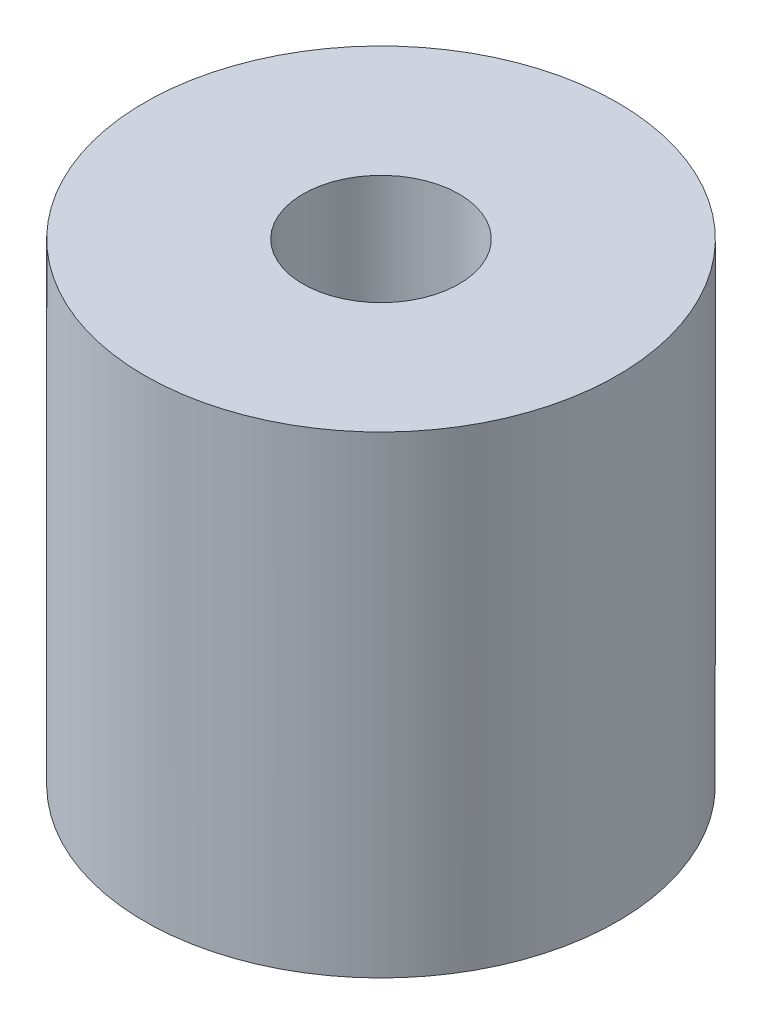
ISO-10303-21;
HEADER;
FILE_DESCRIPTION(('STEP AP214'),'2;1');
FILE_NAME('part.step','',(''),(''),'','','');
FILE_SCHEMA(('AUTOMOTIVE_DESIGN { 1 0 10303 214 1 1 1 1 }'));
ENDSEC;
DATA;
#1=APPLICATION_CONTEXT('core data for automotive mechanical design processes');
#2=APPLICATION_PROTOCOL_DEFINITION('international standard','automotive_design',2000,#1);
#3=PRODUCT_CONTEXT('',#1,'mechanical');
#4=PRODUCT('Part','Part','',(#3));
#5=PRODUCT_RELATED_PRODUCT_CATEGORY('part','',(#4));
#6=PRODUCT_DEFINITION_FORMATION('','',#4);
#7=PRODUCT_DEFINITION_CONTEXT('part definition',#1,'design');
#8=PRODUCT_DEFINITION('design','',#6,#7);
#9=PRODUCT_DEFINITION_SHAPE('','',#8);
#10=(LENGTH_UNIT() NAMED_UNIT(*) SI_UNIT(.MILLI.,.METRE.));
#11=(NAMED_UNIT(*) PLANE_ANGLE_UNIT() SI_UNIT($,.RADIAN.));
#12=(NAMED_UNIT(*) SI_UNIT($,.STERADIAN.) SOLID_ANGLE_UNIT());
#13=UNCERTAINTY_MEASURE_WITH_UNIT(LENGTH_MEASURE(1.E-05),#10,'distance_accuracy_value','');
#14=(GEOMETRIC_REPRESENTATION_CONTEXT(3) GLOBAL_UNCERTAINTY_ASSIGNED_CONTEXT((#13)) GLOBAL_UNIT_ASSIGNED_CONTEXT((#10,
#11,#12)) REPRESENTATION_CONTEXT('',''));
#15=CARTESIAN_POINT('',(0.,0.,0.));
#16=DIRECTION('',(0.,0.,1.));
#17=DIRECTION('',(1.,0.,0.));
#18=AXIS2_PLACEMENT_3D('',#15,#16,#17);
#19=CARTESIAN_POINT('',(0.,12.,0.));
#20=DIRECTION('',(0.,-1.,0.));
#21=DIRECTION('',(0.,0.,-1.));
#22=AXIS2_PLACEMENT_3D('',#19,#20,#21);
#23=CYLINDRICAL_SURFACE('',#22,5.);
#24=CARTESIAN_POINT('',(0.,12.,0.));
#25=DIRECTION('',(0.,1.,0.));
#26=DIRECTION('',(0.,0.,1.));
#27=AXIS2_PLACEMENT_3D('',#24,#25,#26);
#28=CIRCLE('',#27,5.);
#29=CARTESIAN_POINT('',(0.,12.,5.));
#30=VERTEX_POINT('',#29);
#31=EDGE_CURVE('E10',#30,#30,#28,.T.);
#32=ORIENTED_EDGE('',*,*,#31,.F.);
#33=EDGE_LOOP('',(#32));
#34=FACE_BOUND('',#33,.T.);
#35=CARTESIAN_POINT('',(0.,2.,0.));
#36=DIRECTION('',(0.,-1.,0.));
#37=DIRECTION('',(0.,0.,-1.));
#38=AXIS2_PLACEMENT_3D('',#35,#36,#37);
#39=CIRCLE('',#38,5.);
#40=CARTESIAN_POINT('',(0.,2.,-5.));
#41=VERTEX_POINT('',#40);
#42=EDGE_CURVE('E56',#41,#41,#39,.T.);
#43=ORIENTED_EDGE('',*,*,#42,.F.);
#44=EDGE_LOOP('',(#43));
#45=FACE_BOUND('',#44,.T.);
#46=ADVANCED_FACE('F43',(#34,#45),#23,.T.);
#47=CARTESIAN_POINT('',(0.,0.,0.));
#48=DIRECTION('',(0.,-1.,0.));
#49=DIRECTION('',(0.,0.,-1.));
#50=AXIS2_PLACEMENT_3D('',#47,#48,#49);
#51=CYLINDRICAL_SURFACE('',#50,1.65);
#52=CARTESIAN_POINT('',(0.,12.,0.));
#53=DIRECTION('',(0.,-1.,0.));
#54=DIRECTION('',(0.,0.,-1.));
#55=AXIS2_PLACEMENT_3D('',#52,#53,#54);
#56=CIRCLE('',#55,1.65);
#57=CARTESIAN_POINT('',(0.,12.,-1.65));
#58=VERTEX_POINT('',#57);
#59=EDGE_CURVE('E50',#58,#58,#56,.T.);
#60=ORIENTED_EDGE('',*,*,#59,.F.);
#61=EDGE_LOOP('',(#60));
#62=FACE_BOUND('',#61,.T.);
#63=CARTESIAN_POINT('',(0.,2.,0.));
#64=DIRECTION('',(0.,-1.,0.));
#65=DIRECTION('',(0.,0.,-1.));
#66=AXIS2_PLACEMENT_3D('',#63,#64,#65);
#67=CIRCLE('',#66,1.65);
#68=CARTESIAN_POINT('',(0.,2.,-1.65));
#69=VERTEX_POINT('',#68);
#70=EDGE_CURVE('E46',#69,#69,#67,.F.);
#71=ORIENTED_EDGE('',*,*,#70,.F.);
#72=EDGE_LOOP('',(#71));
#73=FACE_BOUND('',#72,.T.);
#74=ADVANCED_FACE('F65',(#62,#73),#51,.F.);
#75=CARTESIAN_POINT('',(0.,12.,0.));
#76=DIRECTION('',(0.,1.,0.));
#77=DIRECTION('',(0.,0.,1.));
#78=AXIS2_PLACEMENT_3D('',#75,#76,#77);
#79=PLANE('',#78);
#80=ORIENTED_EDGE('',*,*,#59,.T.);
#81=EDGE_LOOP('',(#80));
#82=FACE_BOUND('',#81,.T.);
#83=ORIENTED_EDGE('',*,*,#31,.T.);
#84=EDGE_LOOP('',(#83));
#85=FACE_BOUND('',#84,.T.);
#86=ADVANCED_FACE('F67',(#82,#85),#79,.T.);
#87=CARTESIAN_POINT('',(0.,2.,0.));
#88=DIRECTION('',(0.,-1.,0.));
#89=DIRECTION('',(0.,0.,-1.));
#90=AXIS2_PLACEMENT_3D('',#87,#88,#89);
#91=PLANE('',#90);
#92=ORIENTED_EDGE('',*,*,#42,.T.);
#93=EDGE_LOOP('',(#92));
#94=FACE_BOUND('',#93,.T.);
#95=ORIENTED_EDGE('',*,*,#70,.T.);
#96=EDGE_LOOP('',(#95));
#97=FACE_BOUND('',#96,.T.);
#98=ADVANCED_FACE('F63',(#94,#97),#91,.T.);
#99=CLOSED_SHELL('',(#46,#74,#86,#98));
#100=MANIFOLD_SOLID_BREP('B2',#99);
#101=ADVANCED_BREP_SHAPE_REPRESENTATION('',(#18,#100),#14);
#102=SHAPE_DEFINITION_REPRESENTATION(#9,#101);
ENDSEC;
END-ISO-10303-21;
